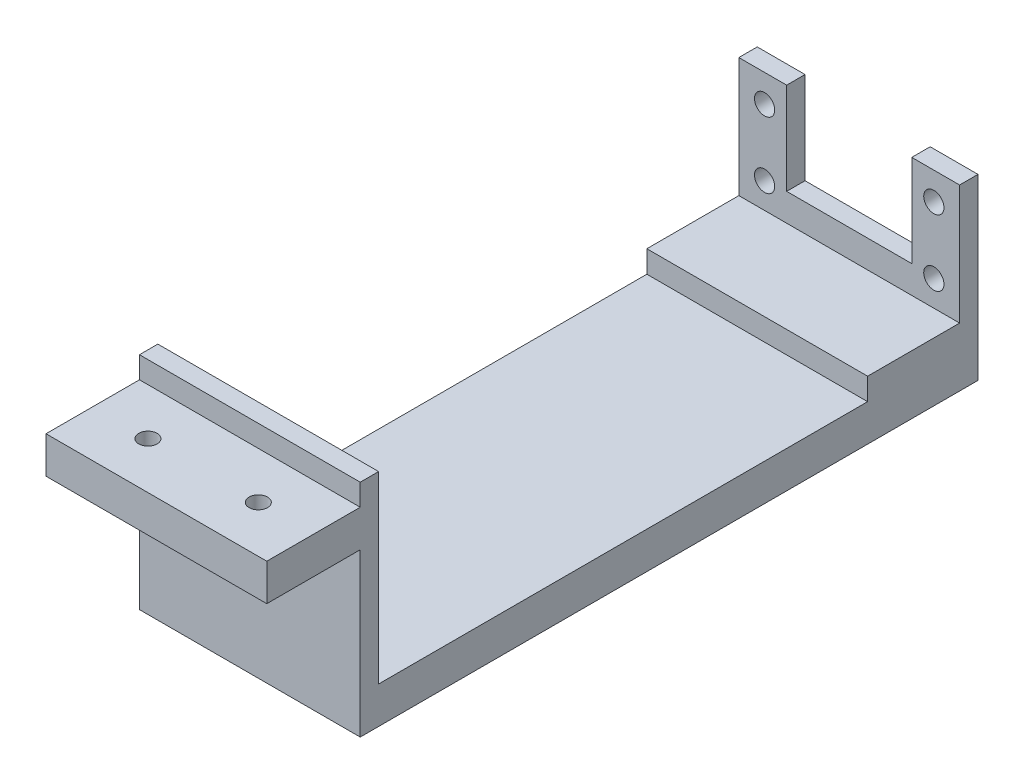
ISO-10303-21;
HEADER;
FILE_DESCRIPTION(('STEP AP214'),'2;1');
FILE_NAME('part.step','',(''),(''),'','','');
FILE_SCHEMA(('AUTOMOTIVE_DESIGN { 1 0 10303 214 1 1 1 1 }'));
ENDSEC;
DATA;
#1=APPLICATION_CONTEXT('core data for automotive mechanical design processes');
#2=APPLICATION_PROTOCOL_DEFINITION('international standard','automotive_design',2000,#1);
#3=PRODUCT_CONTEXT('',#1,'mechanical');
#4=PRODUCT('Part','Part','',(#3));
#5=PRODUCT_RELATED_PRODUCT_CATEGORY('part','',(#4));
#6=PRODUCT_DEFINITION_FORMATION('','',#4);
#7=PRODUCT_DEFINITION_CONTEXT('part definition',#1,'design');
#8=PRODUCT_DEFINITION('design','',#6,#7);
#9=PRODUCT_DEFINITION_SHAPE('','',#8);
#10=(LENGTH_UNIT() NAMED_UNIT(*) SI_UNIT(.MILLI.,.METRE.));
#11=(NAMED_UNIT(*) PLANE_ANGLE_UNIT() SI_UNIT($,.RADIAN.));
#12=(NAMED_UNIT(*) SI_UNIT($,.STERADIAN.) SOLID_ANGLE_UNIT());
#13=UNCERTAINTY_MEASURE_WITH_UNIT(LENGTH_MEASURE(1.E-05),#10,'distance_accuracy_value','');
#14=(GEOMETRIC_REPRESENTATION_CONTEXT(3) GLOBAL_UNCERTAINTY_ASSIGNED_CONTEXT((#13)) GLOBAL_UNIT_ASSIGNED_CONTEXT((#10,
#11,#12)) REPRESENTATION_CONTEXT('',''));
#15=CARTESIAN_POINT('',(0.,0.,0.));
#16=DIRECTION('',(0.,0.,1.));
#17=DIRECTION('',(1.,0.,0.));
#18=AXIS2_PLACEMENT_3D('',#15,#16,#17);
#19=CARTESIAN_POINT('',(0.,0.,167.8942));
#20=DIRECTION('',(0.,0.,-1.));
#21=DIRECTION('',(-1.,0.,0.));
#22=AXIS2_PLACEMENT_3D('',#19,#20,#21);
#23=PLANE('',#22);
#24=DIRECTION('',(-1.,0.,0.));
#25=VECTOR('',#24,1.);
#26=CARTESIAN_POINT('',(0.,38.0996,167.8942));
#27=LINE('',#26,#25);
#28=CARTESIAN_POINT('',(60.,38.0996,167.8942));
#29=VERTEX_POINT('',#28);
#30=CARTESIAN_POINT('',(0.,38.0996,167.8942));
#31=VERTEX_POINT('',#30);
#32=EDGE_CURVE('E194',#29,#31,#27,.T.);
#33=ORIENTED_EDGE('',*,*,#32,.F.);
#34=DIRECTION('',(0.,-1.,0.));
#35=VECTOR('',#34,1.);
#36=CARTESIAN_POINT('',(60.,-6.,167.8942));
#37=LINE('',#36,#35);
#38=CARTESIAN_POINT('',(60.,44.,167.8942));
#39=VERTEX_POINT('',#38);
#40=EDGE_CURVE('E232',#39,#29,#37,.T.);
#41=ORIENTED_EDGE('',*,*,#40,.F.);
#42=DIRECTION('',(1.,0.,0.));
#43=VECTOR('',#42,1.);
#44=CARTESIAN_POINT('',(0.,44.,167.8942));
#45=LINE('',#44,#43);
#46=CARTESIAN_POINT('',(0.,44.,167.8942));
#47=VERTEX_POINT('',#46);
#48=EDGE_CURVE('E213',#47,#39,#45,.T.);
#49=ORIENTED_EDGE('',*,*,#48,.F.);
#50=DIRECTION('',(0.,1.,0.));
#51=VECTOR('',#50,1.);
#52=CARTESIAN_POINT('',(0.,-6.,167.8942));
#53=LINE('',#52,#51);
#54=EDGE_CURVE('E63',#31,#47,#53,.T.);
#55=ORIENTED_EDGE('',*,*,#54,.F.);
#56=EDGE_LOOP('',(#33,#41,#49,#55));
#57=FACE_BOUND('',#56,.T.);
#58=ADVANCED_FACE('F46',(#57),#23,.F.);
#59=DIRECTION('',(1.,0.,0.));
#60=VECTOR('',#59,1.);
#61=CARTESIAN_POINT('',(0.,28.0996,167.8942));
#62=LINE('',#61,#60);
#63=CARTESIAN_POINT('',(0.,28.0996,167.8942));
#64=VERTEX_POINT('',#63);
#65=CARTESIAN_POINT('',(60.,28.0996,167.8942));
#66=VERTEX_POINT('',#65);
#67=EDGE_CURVE('E71',#64,#66,#62,.T.);
#68=ORIENTED_EDGE('',*,*,#67,.F.);
#69=CARTESIAN_POINT('',(0.,-16.,167.8942));
#70=VERTEX_POINT('',#69);
#71=EDGE_CURVE('E197',#70,#64,#53,.T.);
#72=ORIENTED_EDGE('',*,*,#71,.F.);
#73=DIRECTION('',(-1.,0.,0.));
#74=VECTOR('',#73,1.);
#75=CARTESIAN_POINT('',(60.,-16.,167.8942));
#76=LINE('',#75,#74);
#77=CARTESIAN_POINT('',(60.,-16.,167.8942));
#78=VERTEX_POINT('',#77);
#79=EDGE_CURVE('E236',#78,#70,#76,.T.);
#80=ORIENTED_EDGE('',*,*,#79,.F.);
#81=EDGE_CURVE('E237',#66,#78,#37,.T.);
#82=ORIENTED_EDGE('',*,*,#81,.F.);
#83=EDGE_LOOP('',(#68,#72,#80,#82));
#84=FACE_BOUND('',#83,.T.);
#85=ADVANCED_FACE('F415',(#84),#23,.F.);
#86=CARTESIAN_POINT('',(60.,-6.,167.8942));
#87=DIRECTION('',(0.,1.,0.));
#88=DIRECTION('',(0.,0.,1.));
#89=AXIS2_PLACEMENT_3D('',#86,#87,#88);
#90=PLANE('',#89);
#91=DIRECTION('',(0.,0.,-1.));
#92=VECTOR('',#91,1.);
#93=CARTESIAN_POINT('',(0.,-6.,167.8942));
#94=LINE('',#93,#92);
#95=CARTESIAN_POINT('',(0.,-6.,162.8942));
#96=VERTEX_POINT('',#95);
#97=CARTESIAN_POINT('',(0.,-6.,30.));
#98=VERTEX_POINT('',#97);
#99=EDGE_CURVE('E251',#96,#98,#94,.T.);
#100=ORIENTED_EDGE('',*,*,#99,.F.);
#101=DIRECTION('',(-1.,0.,0.));
#102=VECTOR('',#101,1.);
#103=CARTESIAN_POINT('',(0.,-6.,162.8942));
#104=LINE('',#103,#102);
#105=CARTESIAN_POINT('',(60.,-6.,162.8942));
#106=VERTEX_POINT('',#105);
#107=EDGE_CURVE('E199',#106,#96,#104,.T.);
#108=ORIENTED_EDGE('',*,*,#107,.F.);
#109=DIRECTION('',(0.,0.,-1.));
#110=VECTOR('',#109,1.);
#111=CARTESIAN_POINT('',(60.,-6.,167.8942));
#112=LINE('',#111,#110);
#113=CARTESIAN_POINT('',(60.,-6.,30.));
#114=VERTEX_POINT('',#113);
#115=EDGE_CURVE('E247',#106,#114,#112,.T.);
#116=ORIENTED_EDGE('',*,*,#115,.T.);
#117=DIRECTION('',(1.,0.,0.));
#118=VECTOR('',#117,1.);
#119=CARTESIAN_POINT('',(0.,-6.,30.));
#120=LINE('',#119,#118);
#121=EDGE_CURVE('E264',#98,#114,#120,.T.);
#122=ORIENTED_EDGE('',*,*,#121,.F.);
#123=EDGE_LOOP('',(#100,#108,#116,#122));
#124=FACE_BOUND('',#123,.T.);
#125=ADVANCED_FACE('F447',(#124),#90,.T.);
#126=CARTESIAN_POINT('',(60.,0.,5.));
#127=DIRECTION('',(-1.,0.,0.));
#128=DIRECTION('',(0.,-1.,0.));
#129=AXIS2_PLACEMENT_3D('',#126,#127,#128);
#130=PLANE('',#129);
#131=DIRECTION('',(0.,1.,0.));
#132=VECTOR('',#131,1.);
#133=CARTESIAN_POINT('',(60.,0.,0.));
#134=LINE('',#133,#132);
#135=CARTESIAN_POINT('',(60.,-16.,0.));
#136=VERTEX_POINT('',#135);
#137=CARTESIAN_POINT('',(60.,32.5,0.));
#138=VERTEX_POINT('',#137);
#139=EDGE_CURVE('E280',#136,#138,#134,.T.);
#140=ORIENTED_EDGE('',*,*,#139,.T.);
#141=DIRECTION('',(0.,0.,-1.));
#142=VECTOR('',#141,1.);
#143=CARTESIAN_POINT('',(60.,32.5,5.));
#144=LINE('',#143,#142);
#145=CARTESIAN_POINT('',(60.,32.5,5.));
#146=VERTEX_POINT('',#145);
#147=EDGE_CURVE('E11',#146,#138,#144,.T.);
#148=ORIENTED_EDGE('',*,*,#147,.F.);
#149=DIRECTION('',(0.,1.,0.));
#150=VECTOR('',#149,1.);
#151=CARTESIAN_POINT('',(60.,0.,5.));
#152=LINE('',#151,#150);
#153=CARTESIAN_POINT('',(60.,0.,5.));
#154=VERTEX_POINT('',#153);
#155=EDGE_CURVE('E287',#154,#146,#152,.T.);
#156=ORIENTED_EDGE('',*,*,#155,.F.);
#157=DIRECTION('',(0.,0.,1.));
#158=VECTOR('',#157,1.);
#159=CARTESIAN_POINT('',(60.,0.,0.));
#160=LINE('',#159,#158);
#161=CARTESIAN_POINT('',(60.,0.,30.));
#162=VERTEX_POINT('',#161);
#163=EDGE_CURVE('E276',#154,#162,#160,.T.);
#164=ORIENTED_EDGE('',*,*,#163,.T.);
#165=DIRECTION('',(0.,1.,0.));
#166=VECTOR('',#165,1.);
#167=CARTESIAN_POINT('',(60.,0.,30.));
#168=LINE('',#167,#166);
#169=EDGE_CURVE('E268',#114,#162,#168,.T.);
#170=ORIENTED_EDGE('',*,*,#169,.F.);
#171=ORIENTED_EDGE('',*,*,#115,.F.);
#172=DIRECTION('',(0.,-1.,0.));
#173=VECTOR('',#172,1.);
#174=CARTESIAN_POINT('',(60.,44.,162.8942));
#175=LINE('',#174,#173);
#176=CARTESIAN_POINT('',(60.,44.,162.8942));
#177=VERTEX_POINT('',#176);
#178=EDGE_CURVE('E227',#177,#106,#175,.T.);
#179=ORIENTED_EDGE('',*,*,#178,.F.);
#180=DIRECTION('',(0.,0.,-1.));
#181=VECTOR('',#180,1.);
#182=CARTESIAN_POINT('',(60.,44.,167.8942));
#183=LINE('',#182,#181);
#184=EDGE_CURVE('E217',#39,#177,#183,.T.);
#185=ORIENTED_EDGE('',*,*,#184,.F.);
#186=ORIENTED_EDGE('',*,*,#40,.T.);
#187=DIRECTION('',(0.,0.,-1.));
#188=VECTOR('',#187,1.);
#189=CARTESIAN_POINT('',(60.,38.0996,193.2942));
#190=LINE('',#189,#188);
#191=CARTESIAN_POINT('',(60.,38.0996,193.2942));
#192=VERTEX_POINT('',#191);
#193=EDGE_CURVE('E206',#192,#29,#190,.T.);
#194=ORIENTED_EDGE('',*,*,#193,.F.);
#195=DIRECTION('',(0.,1.,0.));
#196=VECTOR('',#195,1.);
#197=CARTESIAN_POINT('',(60.,28.0996,193.2942));
#198=LINE('',#197,#196);
#199=CARTESIAN_POINT('',(60.,28.0996,193.2942));
#200=VERTEX_POINT('',#199);
#201=EDGE_CURVE('E183',#200,#192,#198,.T.);
#202=ORIENTED_EDGE('',*,*,#201,.F.);
#203=DIRECTION('',(0.,0.,-1.));
#204=VECTOR('',#203,1.);
#205=CARTESIAN_POINT('',(60.,28.0996,193.2942));
#206=LINE('',#205,#204);
#207=EDGE_CURVE('E179',#200,#66,#206,.T.);
#208=ORIENTED_EDGE('',*,*,#207,.T.);
#209=ORIENTED_EDGE('',*,*,#81,.T.);
#210=DIRECTION('',(0.,0.,-1.));
#211=VECTOR('',#210,1.);
#212=CARTESIAN_POINT('',(60.,-16.,167.8942));
#213=LINE('',#212,#211);
#214=EDGE_CURVE('E243',#78,#136,#213,.T.);
#215=ORIENTED_EDGE('',*,*,#214,.T.);
#216=EDGE_LOOP('',(#140,#148,#156,#164,#170,#171,#179,#185,#186,#194,#202,#208,#209,#215));
#217=FACE_BOUND('',#216,.T.);
#218=ADVANCED_FACE('F48',(#217),#130,.F.);
#219=CARTESIAN_POINT('',(0.,32.5,5.));
#220=DIRECTION('',(0.,1.,0.));
#221=DIRECTION('',(-1.,0.,0.));
#222=AXIS2_PLACEMENT_3D('',#219,#220,#221);
#223=PLANE('',#222);
#224=DIRECTION('',(1.,0.,0.));
#225=VECTOR('',#224,1.);
#226=CARTESIAN_POINT('',(0.,32.5,0.));
#227=LINE('',#226,#225);
#228=CARTESIAN_POINT('',(47.,32.5,0.));
#229=VERTEX_POINT('',#228);
#230=EDGE_CURVE('E335',#229,#138,#227,.T.);
#231=ORIENTED_EDGE('',*,*,#230,.F.);
#232=DIRECTION('',(0.,0.,-1.));
#233=VECTOR('',#232,1.);
#234=CARTESIAN_POINT('',(47.,32.5,5.));
#235=LINE('',#234,#233);
#236=CARTESIAN_POINT('',(47.,32.5,5.));
#237=VERTEX_POINT('',#236);
#238=EDGE_CURVE('E56',#237,#229,#235,.T.);
#239=ORIENTED_EDGE('',*,*,#238,.F.);
#240=DIRECTION('',(1.,0.,0.));
#241=VECTOR('',#240,1.);
#242=CARTESIAN_POINT('',(0.,32.5,5.));
#243=LINE('',#242,#241);
#244=EDGE_CURVE('E291',#237,#146,#243,.T.);
#245=ORIENTED_EDGE('',*,*,#244,.T.);
#246=ORIENTED_EDGE('',*,*,#147,.T.);
#247=EDGE_LOOP('',(#231,#239,#245,#246));
#248=FACE_BOUND('',#247,.T.);
#249=ADVANCED_FACE('F393',(#248),#223,.T.);
#250=CARTESIAN_POINT('',(47.,0.,5.));
#251=DIRECTION('',(-1.,0.,0.));
#252=DIRECTION('',(0.,0.,1.));
#253=AXIS2_PLACEMENT_3D('',#250,#251,#252);
#254=PLANE('',#253);
#255=DIRECTION('',(0.,1.,0.));
#256=VECTOR('',#255,1.);
#257=CARTESIAN_POINT('',(47.,0.,0.));
#258=LINE('',#257,#256);
#259=CARTESIAN_POINT('',(47.,7.5,0.));
#260=VERTEX_POINT('',#259);
#261=EDGE_CURVE('E339',#260,#229,#258,.T.);
#262=ORIENTED_EDGE('',*,*,#261,.F.);
#263=DIRECTION('',(0.,0.,-1.));
#264=VECTOR('',#263,1.);
#265=CARTESIAN_POINT('',(47.,7.5,5.));
#266=LINE('',#265,#264);
#267=CARTESIAN_POINT('',(47.,7.5,5.));
#268=VERTEX_POINT('',#267);
#269=EDGE_CURVE('E382',#268,#260,#266,.T.);
#270=ORIENTED_EDGE('',*,*,#269,.F.);
#271=DIRECTION('',(0.,1.,0.));
#272=VECTOR('',#271,1.);
#273=CARTESIAN_POINT('',(47.,0.,5.));
#274=LINE('',#273,#272);
#275=EDGE_CURVE('E295',#268,#237,#274,.T.);
#276=ORIENTED_EDGE('',*,*,#275,.T.);
#277=ORIENTED_EDGE('',*,*,#238,.T.);
#278=EDGE_LOOP('',(#262,#270,#276,#277));
#279=FACE_BOUND('',#278,.T.);
#280=ADVANCED_FACE('F389',(#279),#254,.T.);
#281=CARTESIAN_POINT('',(0.,7.5,5.));
#282=DIRECTION('',(0.,1.,0.));
#283=DIRECTION('',(0.,0.,1.));
#284=AXIS2_PLACEMENT_3D('',#281,#282,#283);
#285=PLANE('',#284);
#286=DIRECTION('',(1.,0.,0.));
#287=VECTOR('',#286,1.);
#288=CARTESIAN_POINT('',(0.,7.5,0.));
#289=LINE('',#288,#287);
#290=CARTESIAN_POINT('',(13.,7.5,0.));
#291=VERTEX_POINT('',#290);
#292=EDGE_CURVE('E343',#291,#260,#289,.T.);
#293=ORIENTED_EDGE('',*,*,#292,.F.);
#294=DIRECTION('',(0.,0.,-1.));
#295=VECTOR('',#294,1.);
#296=CARTESIAN_POINT('',(13.,7.5,5.));
#297=LINE('',#296,#295);
#298=CARTESIAN_POINT('',(13.,7.5,5.));
#299=VERTEX_POINT('',#298);
#300=EDGE_CURVE('E379',#299,#291,#297,.T.);
#301=ORIENTED_EDGE('',*,*,#300,.F.);
#302=DIRECTION('',(1.,0.,0.));
#303=VECTOR('',#302,1.);
#304=CARTESIAN_POINT('',(0.,7.5,5.));
#305=LINE('',#304,#303);
#306=EDGE_CURVE('E299',#299,#268,#305,.T.);
#307=ORIENTED_EDGE('',*,*,#306,.T.);
#308=ORIENTED_EDGE('',*,*,#269,.T.);
#309=EDGE_LOOP('',(#293,#301,#307,#308));
#310=FACE_BOUND('',#309,.T.);
#311=ADVANCED_FACE('F401',(#310),#285,.T.);
#312=CARTESIAN_POINT('',(13.,0.,5.));
#313=DIRECTION('',(1.,0.,0.));
#314=DIRECTION('',(0.,1.,0.));
#315=AXIS2_PLACEMENT_3D('',#312,#313,#314);
#316=PLANE('',#315);
#317=DIRECTION('',(0.,-1.,0.));
#318=VECTOR('',#317,1.);
#319=CARTESIAN_POINT('',(13.,0.,0.));
#320=LINE('',#319,#318);
#321=CARTESIAN_POINT('',(13.,32.5,0.));
#322=VERTEX_POINT('',#321);
#323=EDGE_CURVE('E347',#322,#291,#320,.T.);
#324=ORIENTED_EDGE('',*,*,#323,.F.);
#325=DIRECTION('',(0.,0.,-1.));
#326=VECTOR('',#325,1.);
#327=CARTESIAN_POINT('',(13.,32.5,5.));
#328=LINE('',#327,#326);
#329=CARTESIAN_POINT('',(13.,32.5,5.));
#330=VERTEX_POINT('',#329);
#331=EDGE_CURVE('E376',#330,#322,#328,.T.);
#332=ORIENTED_EDGE('',*,*,#331,.F.);
#333=DIRECTION('',(0.,-1.,0.));
#334=VECTOR('',#333,1.);
#335=CARTESIAN_POINT('',(13.,0.,5.));
#336=LINE('',#335,#334);
#337=EDGE_CURVE('E303',#330,#299,#336,.T.);
#338=ORIENTED_EDGE('',*,*,#337,.T.);
#339=ORIENTED_EDGE('',*,*,#300,.T.);
#340=EDGE_LOOP('',(#324,#332,#338,#339));
#341=FACE_BOUND('',#340,.T.);
#342=ADVANCED_FACE('F460',(#341),#316,.T.);
#343=CARTESIAN_POINT('',(0.,32.5,5.));
#344=DIRECTION('',(0.,1.,0.));
#345=DIRECTION('',(-1.,0.,0.));
#346=AXIS2_PLACEMENT_3D('',#343,#344,#345);
#347=PLANE('',#346);
#348=DIRECTION('',(1.,0.,0.));
#349=VECTOR('',#348,1.);
#350=CARTESIAN_POINT('',(0.,32.5,0.));
#351=LINE('',#350,#349);
#352=CARTESIAN_POINT('',(0.,32.5,0.));
#353=VERTEX_POINT('',#352);
#354=EDGE_CURVE('E351',#353,#322,#351,.T.);
#355=ORIENTED_EDGE('',*,*,#354,.F.);
#356=DIRECTION('',(0.,0.,-1.));
#357=VECTOR('',#356,1.);
#358=CARTESIAN_POINT('',(0.,32.5,5.));
#359=LINE('',#358,#357);
#360=CARTESIAN_POINT('',(0.,32.5,5.));
#361=VERTEX_POINT('',#360);
#362=EDGE_CURVE('E331',#361,#353,#359,.T.);
#363=ORIENTED_EDGE('',*,*,#362,.F.);
#364=DIRECTION('',(1.,0.,0.));
#365=VECTOR('',#364,1.);
#366=CARTESIAN_POINT('',(0.,32.5,5.));
#367=LINE('',#366,#365);
#368=EDGE_CURVE('E307',#361,#330,#367,.T.);
#369=ORIENTED_EDGE('',*,*,#368,.T.);
#370=ORIENTED_EDGE('',*,*,#331,.T.);
#371=EDGE_LOOP('',(#355,#363,#369,#370));
#372=FACE_BOUND('',#371,.T.);
#373=ADVANCED_FACE('F458',(#372),#347,.T.);
#374=CARTESIAN_POINT('',(53.,25.,5.));
#375=DIRECTION('',(0.,0.,-1.));
#376=DIRECTION('',(-1.,0.,0.));
#377=AXIS2_PLACEMENT_3D('',#374,#375,#376);
#378=CYLINDRICAL_SURFACE('',#377,2.74999999999999);
#379=CARTESIAN_POINT('',(53.,25.,5.));
#380=DIRECTION('',(0.,0.,1.));
#381=DIRECTION('',(1.,0.,0.));
#382=AXIS2_PLACEMENT_3D('',#379,#380,#381);
#383=CIRCLE('',#382,2.74999999999999);
#384=CARTESIAN_POINT('',(55.75,25.,5.));
#385=VERTEX_POINT('',#384);
#386=EDGE_CURVE('E323',#385,#385,#383,.F.);
#387=ORIENTED_EDGE('',*,*,#386,.F.);
#388=EDGE_LOOP('',(#387));
#389=FACE_BOUND('',#388,.T.);
#390=CARTESIAN_POINT('',(53.,25.,0.));
#391=DIRECTION('',(0.,0.,1.));
#392=DIRECTION('',(1.,0.,0.));
#393=AXIS2_PLACEMENT_3D('',#390,#391,#392);
#394=CIRCLE('',#393,2.74999999999999);
#395=CARTESIAN_POINT('',(55.75,25.,0.));
#396=VERTEX_POINT('',#395);
#397=EDGE_CURVE('E367',#396,#396,#394,.F.);
#398=ORIENTED_EDGE('',*,*,#397,.T.);
#399=EDGE_LOOP('',(#398));
#400=FACE_BOUND('',#399,.T.);
#401=ADVANCED_FACE('F467',(#389,#400),#378,.F.);
#402=CARTESIAN_POINT('',(7.00000000000001,25.,5.));
#403=DIRECTION('',(0.,0.,-1.));
#404=DIRECTION('',(-1.,0.,0.));
#405=AXIS2_PLACEMENT_3D('',#402,#403,#404);
#406=CYLINDRICAL_SURFACE('',#405,2.75);
#407=CARTESIAN_POINT('',(7.00000000000001,25.,5.));
#408=DIRECTION('',(0.,0.,1.));
#409=DIRECTION('',(1.,0.,0.));
#410=AXIS2_PLACEMENT_3D('',#407,#408,#409);
#411=CIRCLE('',#410,2.75);
#412=CARTESIAN_POINT('',(9.75,25.,5.));
#413=VERTEX_POINT('',#412);
#414=EDGE_CURVE('E319',#413,#413,#411,.T.);
#415=ORIENTED_EDGE('',*,*,#414,.T.);
#416=EDGE_LOOP('',(#415));
#417=FACE_BOUND('',#416,.T.);
#418=CARTESIAN_POINT('',(7.00000000000001,25.,0.));
#419=DIRECTION('',(0.,0.,1.));
#420=DIRECTION('',(1.,0.,0.));
#421=AXIS2_PLACEMENT_3D('',#418,#419,#420);
#422=CIRCLE('',#421,2.75);
#423=CARTESIAN_POINT('',(9.75,25.,0.));
#424=VERTEX_POINT('',#423);
#425=EDGE_CURVE('E363',#424,#424,#422,.T.);
#426=ORIENTED_EDGE('',*,*,#425,.F.);
#427=EDGE_LOOP('',(#426));
#428=FACE_BOUND('',#427,.T.);
#429=ADVANCED_FACE('F497',(#417,#428),#406,.F.);
#430=CARTESIAN_POINT('',(7.,7.00000000000001,5.));
#431=DIRECTION('',(0.,0.,-1.));
#432=DIRECTION('',(-1.,0.,0.));
#433=AXIS2_PLACEMENT_3D('',#430,#431,#432);
#434=CYLINDRICAL_SURFACE('',#433,2.75);
#435=CARTESIAN_POINT('',(7.,7.00000000000001,5.));
#436=DIRECTION('',(0.,0.,1.));
#437=DIRECTION('',(1.,0.,0.));
#438=AXIS2_PLACEMENT_3D('',#435,#436,#437);
#439=CIRCLE('',#438,2.75);
#440=CARTESIAN_POINT('',(9.75,7.00000000000001,5.));
#441=VERTEX_POINT('',#440);
#442=EDGE_CURVE('E315',#441,#441,#439,.T.);
#443=ORIENTED_EDGE('',*,*,#442,.T.);
#444=EDGE_LOOP('',(#443));
#445=FACE_BOUND('',#444,.T.);
#446=CARTESIAN_POINT('',(7.,7.00000000000001,0.));
#447=DIRECTION('',(0.,0.,1.));
#448=DIRECTION('',(1.,0.,0.));
#449=AXIS2_PLACEMENT_3D('',#446,#447,#448);
#450=CIRCLE('',#449,2.75);
#451=CARTESIAN_POINT('',(9.75,7.00000000000001,0.));
#452=VERTEX_POINT('',#451);
#453=EDGE_CURVE('E359',#452,#452,#450,.T.);
#454=ORIENTED_EDGE('',*,*,#453,.F.);
#455=EDGE_LOOP('',(#454));
#456=FACE_BOUND('',#455,.T.);
#457=ADVANCED_FACE('F501',(#445,#456),#434,.F.);
#458=CARTESIAN_POINT('',(0.,0.,5.));
#459=DIRECTION('',(-1.,0.,0.));
#460=DIRECTION('',(0.,0.,1.));
#461=AXIS2_PLACEMENT_3D('',#458,#459,#460);
#462=PLANE('',#461);
#463=DIRECTION('',(0.,1.,0.));
#464=VECTOR('',#463,1.);
#465=CARTESIAN_POINT('',(0.,0.,0.));
#466=LINE('',#465,#464);
#467=CARTESIAN_POINT('',(0.,-16.,0.));
#468=VERTEX_POINT('',#467);
#469=EDGE_CURVE('E355',#468,#353,#466,.T.);
#470=ORIENTED_EDGE('',*,*,#469,.F.);
#471=DIRECTION('',(0.,0.,-1.));
#472=VECTOR('',#471,1.);
#473=CARTESIAN_POINT('',(0.,-16.,167.8942));
#474=LINE('',#473,#472);
#475=EDGE_CURVE('E254',#70,#468,#474,.T.);
#476=ORIENTED_EDGE('',*,*,#475,.F.);
#477=ORIENTED_EDGE('',*,*,#71,.T.);
#478=DIRECTION('',(0.,0.,-1.));
#479=VECTOR('',#478,1.);
#480=CARTESIAN_POINT('',(0.,28.0996,193.2942));
#481=LINE('',#480,#479);
#482=CARTESIAN_POINT('',(0.,28.0996,193.2942));
#483=VERTEX_POINT('',#482);
#484=EDGE_CURVE('E177',#483,#64,#481,.T.);
#485=ORIENTED_EDGE('',*,*,#484,.F.);
#486=DIRECTION('',(0.,-1.,0.));
#487=VECTOR('',#486,1.);
#488=CARTESIAN_POINT('',(0.,28.0996,193.2942));
#489=LINE('',#488,#487);
#490=CARTESIAN_POINT('',(0.,38.0996,193.2942));
#491=VERTEX_POINT('',#490);
#492=EDGE_CURVE('E184',#491,#483,#489,.T.);
#493=ORIENTED_EDGE('',*,*,#492,.F.);
#494=DIRECTION('',(0.,0.,-1.));
#495=VECTOR('',#494,1.);
#496=CARTESIAN_POINT('',(0.,38.0996,193.2942));
#497=LINE('',#496,#495);
#498=EDGE_CURVE('E424',#491,#31,#497,.T.);
#499=ORIENTED_EDGE('',*,*,#498,.T.);
#500=ORIENTED_EDGE('',*,*,#54,.T.);
#501=DIRECTION('',(0.,0.,1.));
#502=VECTOR('',#501,1.);
#503=CARTESIAN_POINT('',(0.,44.,167.8942));
#504=LINE('',#503,#502);
#505=CARTESIAN_POINT('',(0.,44.,162.8942));
#506=VERTEX_POINT('',#505);
#507=EDGE_CURVE('E204',#506,#47,#504,.T.);
#508=ORIENTED_EDGE('',*,*,#507,.F.);
#509=DIRECTION('',(0.,-1.,0.));
#510=VECTOR('',#509,1.);
#511=CARTESIAN_POINT('',(0.,44.,162.8942));
#512=LINE('',#511,#510);
#513=EDGE_CURVE('E222',#506,#96,#512,.T.);
#514=ORIENTED_EDGE('',*,*,#513,.T.);
#515=ORIENTED_EDGE('',*,*,#99,.T.);
#516=DIRECTION('',(0.,-1.,0.));
#517=VECTOR('',#516,1.);
#518=CARTESIAN_POINT('',(0.,0.,30.));
#519=LINE('',#518,#517);
#520=CARTESIAN_POINT('',(0.,0.,30.));
#521=VERTEX_POINT('',#520);
#522=EDGE_CURVE('E250',#521,#98,#519,.T.);
#523=ORIENTED_EDGE('',*,*,#522,.F.);
#524=DIRECTION('',(0.,0.,1.));
#525=VECTOR('',#524,1.);
#526=CARTESIAN_POINT('',(0.,0.,0.));
#527=LINE('',#526,#525);
#528=CARTESIAN_POINT('',(0.,0.,5.));
#529=VERTEX_POINT('',#528);
#530=EDGE_CURVE('E277',#529,#521,#527,.T.);
#531=ORIENTED_EDGE('',*,*,#530,.F.);
#532=DIRECTION('',(0.,1.,0.));
#533=VECTOR('',#532,1.);
#534=CARTESIAN_POINT('',(0.,0.,5.));
#535=LINE('',#534,#533);
#536=EDGE_CURVE('E311',#529,#361,#535,.T.);
#537=ORIENTED_EDGE('',*,*,#536,.T.);
#538=ORIENTED_EDGE('',*,*,#362,.T.);
#539=EDGE_LOOP('',(#470,#476,#477,#485,#493,#499,#500,#508,#514,#515,#523,#531,#537,#538));
#540=FACE_BOUND('',#539,.T.);
#541=ADVANCED_FACE('F196',(#540),#462,.T.);
#542=CARTESIAN_POINT('',(53.,7.00000000000001,5.));
#543=DIRECTION('',(0.,0.,-1.));
#544=DIRECTION('',(-1.,0.,0.));
#545=AXIS2_PLACEMENT_3D('',#542,#543,#544);
#546=CYLINDRICAL_SURFACE('',#545,2.75);
#547=CARTESIAN_POINT('',(53.,7.00000000000001,5.));
#548=DIRECTION('',(0.,0.,1.));
#549=DIRECTION('',(1.,0.,0.));
#550=AXIS2_PLACEMENT_3D('',#547,#548,#549);
#551=CIRCLE('',#550,2.75);
#552=CARTESIAN_POINT('',(55.75,7.00000000000001,5.));
#553=VERTEX_POINT('',#552);
#554=EDGE_CURVE('E327',#553,#553,#551,.F.);
#555=ORIENTED_EDGE('',*,*,#554,.F.);
#556=EDGE_LOOP('',(#555));
#557=FACE_BOUND('',#556,.T.);
#558=CARTESIAN_POINT('',(53.,7.00000000000001,0.));
#559=DIRECTION('',(0.,0.,1.));
#560=DIRECTION('',(1.,0.,0.));
#561=AXIS2_PLACEMENT_3D('',#558,#559,#560);
#562=CIRCLE('',#561,2.75);
#563=CARTESIAN_POINT('',(55.75,7.00000000000001,0.));
#564=VERTEX_POINT('',#563);
#565=EDGE_CURVE('E288',#564,#564,#562,.F.);
#566=ORIENTED_EDGE('',*,*,#565,.T.);
#567=EDGE_LOOP('',(#566));
#568=FACE_BOUND('',#567,.T.);
#569=ADVANCED_FACE('F489',(#557,#568),#546,.F.);
#570=CARTESIAN_POINT('',(0.,0.,5.));
#571=DIRECTION('',(0.,0.,1.));
#572=DIRECTION('',(1.,0.,0.));
#573=AXIS2_PLACEMENT_3D('',#570,#571,#572);
#574=PLANE('',#573);
#575=DIRECTION('',(1.,0.,0.));
#576=VECTOR('',#575,1.);
#577=CARTESIAN_POINT('',(0.,0.,5.));
#578=LINE('',#577,#576);
#579=EDGE_CURVE('E283',#529,#154,#578,.T.);
#580=ORIENTED_EDGE('',*,*,#579,.T.);
#581=ORIENTED_EDGE('',*,*,#155,.T.);
#582=ORIENTED_EDGE('',*,*,#244,.F.);
#583=ORIENTED_EDGE('',*,*,#275,.F.);
#584=ORIENTED_EDGE('',*,*,#306,.F.);
#585=ORIENTED_EDGE('',*,*,#337,.F.);
#586=ORIENTED_EDGE('',*,*,#368,.F.);
#587=ORIENTED_EDGE('',*,*,#536,.F.);
#588=EDGE_LOOP('',(#580,#581,#582,#583,#584,#585,#586,#587));
#589=FACE_BOUND('',#588,.T.);
#590=ORIENTED_EDGE('',*,*,#442,.F.);
#591=EDGE_LOOP('',(#590));
#592=FACE_BOUND('',#591,.T.);
#593=ORIENTED_EDGE('',*,*,#414,.F.);
#594=EDGE_LOOP('',(#593));
#595=FACE_BOUND('',#594,.T.);
#596=ORIENTED_EDGE('',*,*,#386,.T.);
#597=EDGE_LOOP('',(#596));
#598=FACE_BOUND('',#597,.T.);
#599=ORIENTED_EDGE('',*,*,#554,.T.);
#600=EDGE_LOOP('',(#599));
#601=FACE_BOUND('',#600,.T.);
#602=ADVANCED_FACE('F404',(#589,#592,#595,#598,#601),#574,.T.);
#603=CARTESIAN_POINT('',(0.,0.,0.));
#604=DIRECTION('',(0.,0.,1.));
#605=DIRECTION('',(1.,0.,0.));
#606=AXIS2_PLACEMENT_3D('',#603,#604,#605);
#607=PLANE('',#606);
#608=ORIENTED_EDGE('',*,*,#139,.F.);
#609=DIRECTION('',(-1.,0.,0.));
#610=VECTOR('',#609,1.);
#611=CARTESIAN_POINT('',(60.,-16.,0.));
#612=LINE('',#611,#610);
#613=EDGE_CURVE('E231',#136,#468,#612,.T.);
#614=ORIENTED_EDGE('',*,*,#613,.T.);
#615=ORIENTED_EDGE('',*,*,#469,.T.);
#616=ORIENTED_EDGE('',*,*,#354,.T.);
#617=ORIENTED_EDGE('',*,*,#323,.T.);
#618=ORIENTED_EDGE('',*,*,#292,.T.);
#619=ORIENTED_EDGE('',*,*,#261,.T.);
#620=ORIENTED_EDGE('',*,*,#230,.T.);
#621=EDGE_LOOP('',(#608,#614,#615,#616,#617,#618,#619,#620));
#622=FACE_BOUND('',#621,.T.);
#623=ORIENTED_EDGE('',*,*,#453,.T.);
#624=EDGE_LOOP('',(#623));
#625=FACE_BOUND('',#624,.T.);
#626=ORIENTED_EDGE('',*,*,#425,.T.);
#627=EDGE_LOOP('',(#626));
#628=FACE_BOUND('',#627,.T.);
#629=ORIENTED_EDGE('',*,*,#397,.F.);
#630=EDGE_LOOP('',(#629));
#631=FACE_BOUND('',#630,.T.);
#632=ORIENTED_EDGE('',*,*,#565,.F.);
#633=EDGE_LOOP('',(#632));
#634=FACE_BOUND('',#633,.T.);
#635=ADVANCED_FACE('F396',(#622,#625,#628,#631,#634),#607,.F.);
#636=CARTESIAN_POINT('',(0.,0.,0.));
#637=DIRECTION('',(0.,1.,0.));
#638=DIRECTION('',(0.,0.,1.));
#639=AXIS2_PLACEMENT_3D('',#636,#637,#638);
#640=PLANE('',#639);
#641=ORIENTED_EDGE('',*,*,#579,.F.);
#642=ORIENTED_EDGE('',*,*,#530,.T.);
#643=DIRECTION('',(-1.,0.,0.));
#644=VECTOR('',#643,1.);
#645=CARTESIAN_POINT('',(0.,0.,30.));
#646=LINE('',#645,#644);
#647=EDGE_CURVE('E272',#162,#521,#646,.T.);
#648=ORIENTED_EDGE('',*,*,#647,.F.);
#649=ORIENTED_EDGE('',*,*,#163,.F.);
#650=EDGE_LOOP('',(#641,#642,#648,#649));
#651=FACE_BOUND('',#650,.T.);
#652=ADVANCED_FACE('F454',(#651),#640,.T.);
#653=CARTESIAN_POINT('',(0.,0.,30.));
#654=DIRECTION('',(0.,0.,1.));
#655=DIRECTION('',(1.,0.,0.));
#656=AXIS2_PLACEMENT_3D('',#653,#654,#655);
#657=PLANE('',#656);
#658=ORIENTED_EDGE('',*,*,#522,.T.);
#659=ORIENTED_EDGE('',*,*,#121,.T.);
#660=ORIENTED_EDGE('',*,*,#169,.T.);
#661=ORIENTED_EDGE('',*,*,#647,.T.);
#662=EDGE_LOOP('',(#658,#659,#660,#661));
#663=FACE_BOUND('',#662,.T.);
#664=ADVANCED_FACE('F451',(#663),#657,.T.);
#665=CARTESIAN_POINT('',(60.,-16.,167.8942));
#666=DIRECTION('',(0.,-1.,0.));
#667=DIRECTION('',(0.,0.,-1.));
#668=AXIS2_PLACEMENT_3D('',#665,#666,#667);
#669=PLANE('',#668);
#670=ORIENTED_EDGE('',*,*,#613,.F.);
#671=ORIENTED_EDGE('',*,*,#214,.F.);
#672=ORIENTED_EDGE('',*,*,#79,.T.);
#673=ORIENTED_EDGE('',*,*,#475,.T.);
#674=EDGE_LOOP('',(#670,#671,#672,#673));
#675=FACE_BOUND('',#674,.T.);
#676=ADVANCED_FACE('F413',(#675),#669,.T.);
#677=CARTESIAN_POINT('',(0.,44.,162.8942));
#678=DIRECTION('',(0.,0.,1.));
#679=DIRECTION('',(1.,0.,0.));
#680=AXIS2_PLACEMENT_3D('',#677,#678,#679);
#681=PLANE('',#680);
#682=ORIENTED_EDGE('',*,*,#107,.T.);
#683=ORIENTED_EDGE('',*,*,#513,.F.);
#684=DIRECTION('',(-1.,0.,0.));
#685=VECTOR('',#684,1.);
#686=CARTESIAN_POINT('',(0.,44.,162.8942));
#687=LINE('',#686,#685);
#688=EDGE_CURVE('E220',#177,#506,#687,.T.);
#689=ORIENTED_EDGE('',*,*,#688,.F.);
#690=ORIENTED_EDGE('',*,*,#178,.T.);
#691=EDGE_LOOP('',(#682,#683,#689,#690));
#692=FACE_BOUND('',#691,.T.);
#693=ADVANCED_FACE('F442',(#692),#681,.F.);
#694=CARTESIAN_POINT('',(0.,44.,0.));
#695=DIRECTION('',(0.,-1.,0.));
#696=DIRECTION('',(0.,0.,-1.));
#697=AXIS2_PLACEMENT_3D('',#694,#695,#696);
#698=PLANE('',#697);
#699=ORIENTED_EDGE('',*,*,#507,.T.);
#700=ORIENTED_EDGE('',*,*,#48,.T.);
#701=ORIENTED_EDGE('',*,*,#184,.T.);
#702=ORIENTED_EDGE('',*,*,#688,.T.);
#703=EDGE_LOOP('',(#699,#700,#701,#702));
#704=FACE_BOUND('',#703,.T.);
#705=ADVANCED_FACE('F437',(#704),#698,.F.);
#706=CARTESIAN_POINT('',(0.,28.0996,193.2942));
#707=DIRECTION('',(0.,1.,0.));
#708=DIRECTION('',(0.,0.,1.));
#709=AXIS2_PLACEMENT_3D('',#706,#707,#708);
#710=PLANE('',#709);
#711=CARTESIAN_POINT('',(15.,28.0996,180.5942));
#712=DIRECTION('',(0.,1.,0.));
#713=DIRECTION('',(0.,0.,1.));
#714=AXIS2_PLACEMENT_3D('',#711,#712,#713);
#715=CIRCLE('',#714,2.49999999999999);
#716=CARTESIAN_POINT('',(15.,28.0996,183.0942));
#717=VERTEX_POINT('',#716);
#718=EDGE_CURVE('E728',#717,#717,#715,.T.);
#719=ORIENTED_EDGE('',*,*,#718,.T.);
#720=EDGE_LOOP('',(#719));
#721=FACE_BOUND('',#720,.T.);
#722=CARTESIAN_POINT('',(45.,28.0996,180.5942));
#723=DIRECTION('',(0.,1.,0.));
#724=DIRECTION('',(0.,0.,1.));
#725=AXIS2_PLACEMENT_3D('',#722,#723,#724);
#726=CIRCLE('',#725,2.49999999999999);
#727=CARTESIAN_POINT('',(45.,28.0996,183.0942));
#728=VERTEX_POINT('',#727);
#729=EDGE_CURVE('E50',#728,#728,#726,.T.);
#730=ORIENTED_EDGE('',*,*,#729,.T.);
#731=EDGE_LOOP('',(#730));
#732=FACE_BOUND('',#731,.T.);
#733=ORIENTED_EDGE('',*,*,#67,.T.);
#734=ORIENTED_EDGE('',*,*,#207,.F.);
#735=DIRECTION('',(1.,0.,0.));
#736=VECTOR('',#735,1.);
#737=CARTESIAN_POINT('',(0.,28.0996,193.2942));
#738=LINE('',#737,#736);
#739=EDGE_CURVE('E173',#483,#200,#738,.T.);
#740=ORIENTED_EDGE('',*,*,#739,.F.);
#741=ORIENTED_EDGE('',*,*,#484,.T.);
#742=EDGE_LOOP('',(#733,#734,#740,#741));
#743=FACE_BOUND('',#742,.T.);
#744=ADVANCED_FACE('F175',(#721,#732,#743),#710,.F.);
#745=CARTESIAN_POINT('',(0.,38.0996,193.2942));
#746=DIRECTION('',(0.,-1.,0.));
#747=DIRECTION('',(0.,0.,-1.));
#748=AXIS2_PLACEMENT_3D('',#745,#746,#747);
#749=PLANE('',#748);
#750=CARTESIAN_POINT('',(15.,38.0996,180.5942));
#751=DIRECTION('',(0.,1.,0.));
#752=DIRECTION('',(0.,0.,1.));
#753=AXIS2_PLACEMENT_3D('',#750,#751,#752);
#754=CIRCLE('',#753,2.49999999999999);
#755=CARTESIAN_POINT('',(15.,38.0996,183.0942));
#756=VERTEX_POINT('',#755);
#757=EDGE_CURVE('E725',#756,#756,#754,.T.);
#758=ORIENTED_EDGE('',*,*,#757,.F.);
#759=EDGE_LOOP('',(#758));
#760=FACE_BOUND('',#759,.T.);
#761=CARTESIAN_POINT('',(45.,38.0996,180.5942));
#762=DIRECTION('',(0.,1.,0.));
#763=DIRECTION('',(0.,0.,1.));
#764=AXIS2_PLACEMENT_3D('',#761,#762,#763);
#765=CIRCLE('',#764,2.49999999999999);
#766=CARTESIAN_POINT('',(45.,38.0996,183.0942));
#767=VERTEX_POINT('',#766);
#768=EDGE_CURVE('E730',#767,#767,#765,.T.);
#769=ORIENTED_EDGE('',*,*,#768,.F.);
#770=EDGE_LOOP('',(#769));
#771=FACE_BOUND('',#770,.T.);
#772=ORIENTED_EDGE('',*,*,#32,.T.);
#773=ORIENTED_EDGE('',*,*,#498,.F.);
#774=DIRECTION('',(-1.,0.,0.));
#775=VECTOR('',#774,1.);
#776=CARTESIAN_POINT('',(0.,38.0996,193.2942));
#777=LINE('',#776,#775);
#778=EDGE_CURVE('E189',#192,#491,#777,.T.);
#779=ORIENTED_EDGE('',*,*,#778,.F.);
#780=ORIENTED_EDGE('',*,*,#193,.T.);
#781=EDGE_LOOP('',(#772,#773,#779,#780));
#782=FACE_BOUND('',#781,.T.);
#783=ADVANCED_FACE('F432',(#760,#771,#782),#749,.F.);
#784=CARTESIAN_POINT('',(0.,0.,193.2942));
#785=DIRECTION('',(0.,0.,-1.));
#786=DIRECTION('',(-1.,0.,0.));
#787=AXIS2_PLACEMENT_3D('',#784,#785,#786);
#788=PLANE('',#787);
#789=ORIENTED_EDGE('',*,*,#492,.T.);
#790=ORIENTED_EDGE('',*,*,#739,.T.);
#791=ORIENTED_EDGE('',*,*,#201,.T.);
#792=ORIENTED_EDGE('',*,*,#778,.T.);
#793=EDGE_LOOP('',(#789,#790,#791,#792));
#794=FACE_BOUND('',#793,.T.);
#795=ADVANCED_FACE('F187',(#794),#788,.F.);
#796=CARTESIAN_POINT('',(45.,38.0996,180.5942));
#797=DIRECTION('',(0.,1.,0.));
#798=DIRECTION('',(0.,0.,1.));
#799=AXIS2_PLACEMENT_3D('',#796,#797,#798);
#800=CYLINDRICAL_SURFACE('',#799,2.49999999999999);
#801=ORIENTED_EDGE('',*,*,#768,.T.);
#802=EDGE_LOOP('',(#801));
#803=FACE_BOUND('',#802,.T.);
#804=ORIENTED_EDGE('',*,*,#729,.F.);
#805=EDGE_LOOP('',(#804));
#806=FACE_BOUND('',#805,.T.);
#807=ADVANCED_FACE('F520',(#803,#806),#800,.F.);
#808=CARTESIAN_POINT('',(15.,38.0996,180.5942));
#809=DIRECTION('',(0.,1.,0.));
#810=DIRECTION('',(0.,0.,1.));
#811=AXIS2_PLACEMENT_3D('',#808,#809,#810);
#812=CYLINDRICAL_SURFACE('',#811,2.49999999999999);
#813=ORIENTED_EDGE('',*,*,#757,.T.);
#814=EDGE_LOOP('',(#813));
#815=FACE_BOUND('',#814,.T.);
#816=ORIENTED_EDGE('',*,*,#718,.F.);
#817=EDGE_LOOP('',(#816));
#818=FACE_BOUND('',#817,.T.);
#819=ADVANCED_FACE('F543',(#815,#818),#812,.F.);
#820=CLOSED_SHELL('',(#58,#85,#125,#218,#249,#280,#311,#342,#373,#401,#429,#457,#541,#569,#602,
#635,#652,#664,#676,#693,#705,#744,#783,#795,#807,#819));
#821=MANIFOLD_SOLID_BREP('B2',#820);
#822=ADVANCED_BREP_SHAPE_REPRESENTATION('',(#18,#821),#14);
#823=SHAPE_DEFINITION_REPRESENTATION(#9,#822);
ENDSEC;
END-ISO-10303-21;
